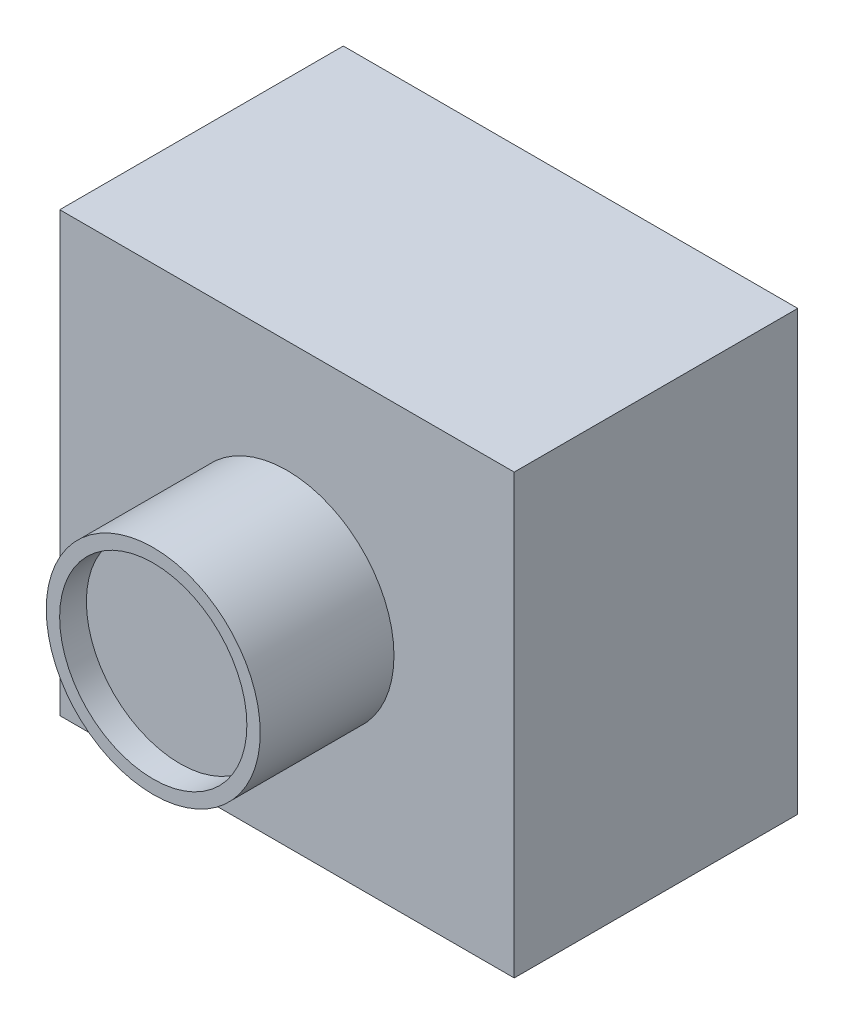
ISO-10303-21;
HEADER;
FILE_DESCRIPTION(('STEP AP214'),'2;1');
FILE_NAME('part.step','',(''),(''),'','','');
FILE_SCHEMA(('AUTOMOTIVE_DESIGN { 1 0 10303 214 1 1 1 1 }'));
ENDSEC;
DATA;
#1=APPLICATION_CONTEXT('core data for automotive mechanical design processes');
#2=APPLICATION_PROTOCOL_DEFINITION('international standard','automotive_design',2000,#1);
#3=PRODUCT_CONTEXT('',#1,'mechanical');
#4=PRODUCT('Part','Part','',(#3));
#5=PRODUCT_RELATED_PRODUCT_CATEGORY('part','',(#4));
#6=PRODUCT_DEFINITION_FORMATION('','',#4);
#7=PRODUCT_DEFINITION_CONTEXT('part definition',#1,'design');
#8=PRODUCT_DEFINITION('design','',#6,#7);
#9=PRODUCT_DEFINITION_SHAPE('','',#8);
#10=(LENGTH_UNIT() NAMED_UNIT(*) SI_UNIT(.MILLI.,.METRE.));
#11=(NAMED_UNIT(*) PLANE_ANGLE_UNIT() SI_UNIT($,.RADIAN.));
#12=(NAMED_UNIT(*) SI_UNIT($,.STERADIAN.) SOLID_ANGLE_UNIT());
#13=UNCERTAINTY_MEASURE_WITH_UNIT(LENGTH_MEASURE(1.E-05),#10,'distance_accuracy_value','');
#14=(GEOMETRIC_REPRESENTATION_CONTEXT(3) GLOBAL_UNCERTAINTY_ASSIGNED_CONTEXT((#13)) GLOBAL_UNIT_ASSIGNED_CONTEXT((#10,
#11,#12)) REPRESENTATION_CONTEXT('',''));
#15=CARTESIAN_POINT('',(0.,0.,0.));
#16=DIRECTION('',(0.,0.,1.));
#17=DIRECTION('',(1.,0.,0.));
#18=AXIS2_PLACEMENT_3D('',#15,#16,#17);
#19=CARTESIAN_POINT('',(84.95,-81.9,-78.));
#20=DIRECTION('',(1.,0.,0.));
#21=DIRECTION('',(0.,0.,-1.));
#22=AXIS2_PLACEMENT_3D('',#19,#20,#21);
#23=PLANE('',#22);
#24=DIRECTION('',(0.,0.,1.));
#25=VECTOR('',#24,1.);
#26=CARTESIAN_POINT('',(84.95,81.9,-78.));
#27=LINE('',#26,#25);
#28=CARTESIAN_POINT('',(84.95,81.9,-78.));
#29=VERTEX_POINT('',#28);
#30=CARTESIAN_POINT('',(84.95,81.9,28.));
#31=VERTEX_POINT('',#30);
#32=EDGE_CURVE('E46',#29,#31,#27,.T.);
#33=ORIENTED_EDGE('',*,*,#32,.T.);
#34=DIRECTION('',(0.,1.,0.));
#35=VECTOR('',#34,1.);
#36=CARTESIAN_POINT('',(84.95,-81.9,28.));
#37=LINE('',#36,#35);
#38=CARTESIAN_POINT('',(84.95,-81.9,28.));
#39=VERTEX_POINT('',#38);
#40=EDGE_CURVE('E59',#39,#31,#37,.T.);
#41=ORIENTED_EDGE('',*,*,#40,.F.);
#42=DIRECTION('',(0.,0.,1.));
#43=VECTOR('',#42,1.);
#44=CARTESIAN_POINT('',(84.95,-81.9,-78.));
#45=LINE('',#44,#43);
#46=CARTESIAN_POINT('',(84.95,-81.9,-78.));
#47=VERTEX_POINT('',#46);
#48=EDGE_CURVE('E11',#47,#39,#45,.T.);
#49=ORIENTED_EDGE('',*,*,#48,.F.);
#50=DIRECTION('',(0.,1.,0.));
#51=VECTOR('',#50,1.);
#52=CARTESIAN_POINT('',(84.95,-81.9,-78.));
#53=LINE('',#52,#51);
#54=EDGE_CURVE('E111',#47,#29,#53,.T.);
#55=ORIENTED_EDGE('',*,*,#54,.T.);
#56=EDGE_LOOP('',(#33,#41,#49,#55));
#57=FACE_BOUND('',#56,.T.);
#58=ADVANCED_FACE('F43',(#57),#23,.T.);
#59=CARTESIAN_POINT('',(-84.95,-81.9,-78.));
#60=DIRECTION('',(0.,-1.,0.));
#61=DIRECTION('',(0.,0.,-1.));
#62=AXIS2_PLACEMENT_3D('',#59,#60,#61);
#63=PLANE('',#62);
#64=ORIENTED_EDGE('',*,*,#48,.T.);
#65=DIRECTION('',(1.,0.,0.));
#66=VECTOR('',#65,1.);
#67=CARTESIAN_POINT('',(-84.95,-81.9,28.));
#68=LINE('',#67,#66);
#69=CARTESIAN_POINT('',(-84.95,-81.9,28.));
#70=VERTEX_POINT('',#69);
#71=EDGE_CURVE('E97',#70,#39,#68,.T.);
#72=ORIENTED_EDGE('',*,*,#71,.F.);
#73=DIRECTION('',(0.,0.,1.));
#74=VECTOR('',#73,1.);
#75=CARTESIAN_POINT('',(-84.95,-81.9,-78.));
#76=LINE('',#75,#74);
#77=CARTESIAN_POINT('',(-84.95,-81.9,-78.));
#78=VERTEX_POINT('',#77);
#79=EDGE_CURVE('E51',#78,#70,#76,.T.);
#80=ORIENTED_EDGE('',*,*,#79,.F.);
#81=DIRECTION('',(1.,0.,0.));
#82=VECTOR('',#81,1.);
#83=CARTESIAN_POINT('',(-84.95,-81.9,-78.));
#84=LINE('',#83,#82);
#85=EDGE_CURVE('E104',#78,#47,#84,.T.);
#86=ORIENTED_EDGE('',*,*,#85,.T.);
#87=EDGE_LOOP('',(#64,#72,#80,#86));
#88=FACE_BOUND('',#87,.T.);
#89=ADVANCED_FACE('F152',(#88),#63,.T.);
#90=CARTESIAN_POINT('',(-84.95,-81.9,-78.));
#91=DIRECTION('',(-1.,0.,0.));
#92=DIRECTION('',(0.,0.,1.));
#93=AXIS2_PLACEMENT_3D('',#90,#91,#92);
#94=PLANE('',#93);
#95=ORIENTED_EDGE('',*,*,#79,.T.);
#96=DIRECTION('',(0.,-1.,0.));
#97=VECTOR('',#96,1.);
#98=CARTESIAN_POINT('',(-84.95,81.9,28.));
#99=LINE('',#98,#97);
#100=CARTESIAN_POINT('',(-84.95,81.9,28.));
#101=VERTEX_POINT('',#100);
#102=EDGE_CURVE('E84',#101,#70,#99,.T.);
#103=ORIENTED_EDGE('',*,*,#102,.F.);
#104=DIRECTION('',(0.,0.,1.));
#105=VECTOR('',#104,1.);
#106=CARTESIAN_POINT('',(-84.95,81.9,-78.));
#107=LINE('',#106,#105);
#108=CARTESIAN_POINT('',(-84.95,81.9,-78.));
#109=VERTEX_POINT('',#108);
#110=EDGE_CURVE('E95',#109,#101,#107,.T.);
#111=ORIENTED_EDGE('',*,*,#110,.F.);
#112=DIRECTION('',(0.,-1.,0.));
#113=VECTOR('',#112,1.);
#114=CARTESIAN_POINT('',(-84.95,-81.9,-78.));
#115=LINE('',#114,#113);
#116=EDGE_CURVE('E108',#109,#78,#115,.T.);
#117=ORIENTED_EDGE('',*,*,#116,.T.);
#118=EDGE_LOOP('',(#95,#103,#111,#117));
#119=FACE_BOUND('',#118,.T.);
#120=ADVANCED_FACE('F93',(#119),#94,.T.);
#121=CARTESIAN_POINT('',(-84.95,81.9,-78.));
#122=DIRECTION('',(0.,1.,0.));
#123=DIRECTION('',(0.,0.,1.));
#124=AXIS2_PLACEMENT_3D('',#121,#122,#123);
#125=PLANE('',#124);
#126=ORIENTED_EDGE('',*,*,#110,.T.);
#127=DIRECTION('',(-1.,0.,0.));
#128=VECTOR('',#127,1.);
#129=CARTESIAN_POINT('',(84.95,81.9,28.));
#130=LINE('',#129,#128);
#131=EDGE_CURVE('E81',#31,#101,#130,.T.);
#132=ORIENTED_EDGE('',*,*,#131,.F.);
#133=ORIENTED_EDGE('',*,*,#32,.F.);
#134=DIRECTION('',(-1.,0.,0.));
#135=VECTOR('',#134,1.);
#136=CARTESIAN_POINT('',(-84.95,81.9,-78.));
#137=LINE('',#136,#135);
#138=EDGE_CURVE('E102',#29,#109,#137,.T.);
#139=ORIENTED_EDGE('',*,*,#138,.T.);
#140=EDGE_LOOP('',(#126,#132,#133,#139));
#141=FACE_BOUND('',#140,.T.);
#142=ADVANCED_FACE('F100',(#141),#125,.T.);
#143=CARTESIAN_POINT('',(0.,0.,-78.));
#144=DIRECTION('',(0.,0.,-1.));
#145=DIRECTION('',(-1.,0.,0.));
#146=AXIS2_PLACEMENT_3D('',#143,#144,#145);
#147=PLANE('',#146);
#148=ORIENTED_EDGE('',*,*,#54,.F.);
#149=ORIENTED_EDGE('',*,*,#85,.F.);
#150=ORIENTED_EDGE('',*,*,#116,.F.);
#151=ORIENTED_EDGE('',*,*,#138,.F.);
#152=EDGE_LOOP('',(#148,#149,#150,#151));
#153=FACE_BOUND('',#152,.T.);
#154=ADVANCED_FACE('F148',(#153),#147,.T.);
#155=CARTESIAN_POINT('',(0.,0.,28.));
#156=DIRECTION('',(0.,0.,1.));
#157=DIRECTION('',(1.,0.,0.));
#158=AXIS2_PLACEMENT_3D('',#155,#156,#157);
#159=PLANE('',#158);
#160=CARTESIAN_POINT('',(0.,0.,28.));
#161=DIRECTION('',(0.,0.,1.));
#162=DIRECTION('',(1.,0.,0.));
#163=AXIS2_PLACEMENT_3D('',#160,#161,#162);
#164=CIRCLE('',#163,40.);
#165=CARTESIAN_POINT('',(40.,0.,28.));
#166=VERTEX_POINT('',#165);
#167=EDGE_CURVE('E89',#166,#166,#164,.T.);
#168=ORIENTED_EDGE('',*,*,#167,.F.);
#169=EDGE_LOOP('',(#168));
#170=FACE_BOUND('',#169,.T.);
#171=ORIENTED_EDGE('',*,*,#131,.T.);
#172=ORIENTED_EDGE('',*,*,#102,.T.);
#173=ORIENTED_EDGE('',*,*,#71,.T.);
#174=ORIENTED_EDGE('',*,*,#40,.T.);
#175=EDGE_LOOP('',(#171,#172,#173,#174));
#176=FACE_BOUND('',#175,.T.);
#177=ADVANCED_FACE('F83',(#170,#176),#159,.T.);
#178=CARTESIAN_POINT('',(0.,0.,28.));
#179=DIRECTION('',(0.,0.,1.));
#180=DIRECTION('',(1.,0.,0.));
#181=AXIS2_PLACEMENT_3D('',#178,#179,#180);
#182=CYLINDRICAL_SURFACE('',#181,40.);
#183=ORIENTED_EDGE('',*,*,#167,.T.);
#184=EDGE_LOOP('',(#183));
#185=FACE_BOUND('',#184,.T.);
#186=CARTESIAN_POINT('',(0.,0.,78.));
#187=DIRECTION('',(0.,0.,1.));
#188=DIRECTION('',(1.,0.,0.));
#189=AXIS2_PLACEMENT_3D('',#186,#187,#188);
#190=CIRCLE('',#189,40.);
#191=CARTESIAN_POINT('',(40.,0.,78.));
#192=VERTEX_POINT('',#191);
#193=EDGE_CURVE('E115',#192,#192,#190,.T.);
#194=ORIENTED_EDGE('',*,*,#193,.F.);
#195=EDGE_LOOP('',(#194));
#196=FACE_BOUND('',#195,.T.);
#197=ADVANCED_FACE('F138',(#185,#196),#182,.T.);
#198=CARTESIAN_POINT('',(0.,0.,78.));
#199=DIRECTION('',(0.,0.,-1.));
#200=DIRECTION('',(-1.,0.,0.));
#201=AXIS2_PLACEMENT_3D('',#198,#199,#200);
#202=PLANE('',#201);
#203=CARTESIAN_POINT('',(0.,0.,78.));
#204=DIRECTION('',(0.,0.,1.));
#205=DIRECTION('',(1.,0.,0.));
#206=AXIS2_PLACEMENT_3D('',#203,#204,#205);
#207=CIRCLE('',#206,35.);
#208=CARTESIAN_POINT('',(35.,0.,78.));
#209=VERTEX_POINT('',#208);
#210=EDGE_CURVE('E121',#209,#209,#207,.T.);
#211=ORIENTED_EDGE('',*,*,#210,.F.);
#212=EDGE_LOOP('',(#211));
#213=FACE_BOUND('',#212,.T.);
#214=ORIENTED_EDGE('',*,*,#193,.T.);
#215=EDGE_LOOP('',(#214));
#216=FACE_BOUND('',#215,.T.);
#217=ADVANCED_FACE('F132',(#213,#216),#202,.F.);
#218=CARTESIAN_POINT('',(0.,0.,68.));
#219=DIRECTION('',(0.,0.,1.));
#220=DIRECTION('',(1.,0.,0.));
#221=AXIS2_PLACEMENT_3D('',#218,#219,#220);
#222=CYLINDRICAL_SURFACE('',#221,35.);
#223=CARTESIAN_POINT('',(0.,0.,68.));
#224=DIRECTION('',(0.,0.,1.));
#225=DIRECTION('',(1.,0.,0.));
#226=AXIS2_PLACEMENT_3D('',#223,#224,#225);
#227=CIRCLE('',#226,35.);
#228=CARTESIAN_POINT('',(35.,0.,68.));
#229=VERTEX_POINT('',#228);
#230=EDGE_CURVE('E118',#229,#229,#227,.T.);
#231=ORIENTED_EDGE('',*,*,#230,.F.);
#232=EDGE_LOOP('',(#231));
#233=FACE_BOUND('',#232,.T.);
#234=ORIENTED_EDGE('',*,*,#210,.T.);
#235=EDGE_LOOP('',(#234));
#236=FACE_BOUND('',#235,.T.);
#237=ADVANCED_FACE('F129',(#233,#236),#222,.F.);
#238=CARTESIAN_POINT('',(0.,0.,68.));
#239=DIRECTION('',(0.,0.,1.));
#240=DIRECTION('',(1.,0.,0.));
#241=AXIS2_PLACEMENT_3D('',#238,#239,#240);
#242=PLANE('',#241);
#243=ORIENTED_EDGE('',*,*,#230,.T.);
#244=EDGE_LOOP('',(#243));
#245=FACE_BOUND('',#244,.T.);
#246=ADVANCED_FACE('F127',(#245),#242,.T.);
#247=CLOSED_SHELL('',(#58,#89,#120,#142,#154,#177,#197,#217,#237,#246));
#248=MANIFOLD_SOLID_BREP('B2',#247);
#249=ADVANCED_BREP_SHAPE_REPRESENTATION('',(#18,#248),#14);
#250=SHAPE_DEFINITION_REPRESENTATION(#9,#249);
ENDSEC;
END-ISO-10303-21;
